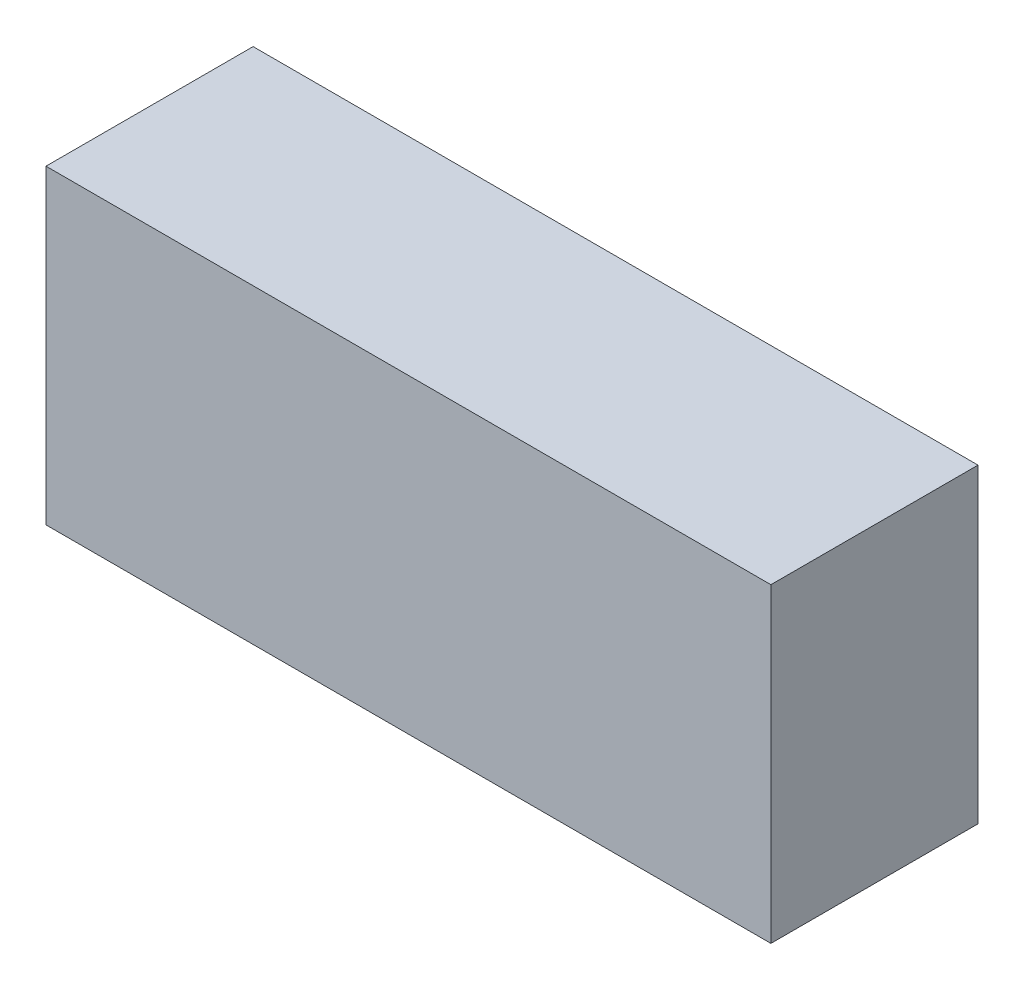
ISO-10303-21;
HEADER;
FILE_DESCRIPTION(('STEP AP214'),'2;1');
FILE_NAME('part.step','',(''),(''),'','','');
FILE_SCHEMA(('AUTOMOTIVE_DESIGN { 1 0 10303 214 1 1 1 1 }'));
ENDSEC;
DATA;
#1=APPLICATION_CONTEXT('core data for automotive mechanical design processes');
#2=APPLICATION_PROTOCOL_DEFINITION('international standard','automotive_design',2000,#1);
#3=PRODUCT_CONTEXT('',#1,'mechanical');
#4=PRODUCT('Part','Part','',(#3));
#5=PRODUCT_RELATED_PRODUCT_CATEGORY('part','',(#4));
#6=PRODUCT_DEFINITION_FORMATION('','',#4);
#7=PRODUCT_DEFINITION_CONTEXT('part definition',#1,'design');
#8=PRODUCT_DEFINITION('design','',#6,#7);
#9=PRODUCT_DEFINITION_SHAPE('','',#8);
#10=(LENGTH_UNIT() NAMED_UNIT(*) SI_UNIT(.MILLI.,.METRE.));
#11=(NAMED_UNIT(*) PLANE_ANGLE_UNIT() SI_UNIT($,.RADIAN.));
#12=(NAMED_UNIT(*) SI_UNIT($,.STERADIAN.) SOLID_ANGLE_UNIT());
#13=UNCERTAINTY_MEASURE_WITH_UNIT(LENGTH_MEASURE(1.E-05),#10,'distance_accuracy_value','');
#14=(GEOMETRIC_REPRESENTATION_CONTEXT(3) GLOBAL_UNCERTAINTY_ASSIGNED_CONTEXT((#13)) GLOBAL_UNIT_ASSIGNED_CONTEXT((#10,
#11,#12)) REPRESENTATION_CONTEXT('',''));
#15=CARTESIAN_POINT('',(0.,0.,0.));
#16=DIRECTION('',(0.,0.,1.));
#17=DIRECTION('',(1.,0.,0.));
#18=AXIS2_PLACEMENT_3D('',#15,#16,#17);
#19=CARTESIAN_POINT('',(0.,0.,20.));
#20=DIRECTION('',(1.,0.,0.));
#21=DIRECTION('',(0.,1.,0.));
#22=AXIS2_PLACEMENT_3D('',#19,#20,#21);
#23=PLANE('',#22);
#24=DIRECTION('',(0.,-1.,0.));
#25=VECTOR('',#24,1.);
#26=CARTESIAN_POINT('',(0.,0.,0.));
#27=LINE('',#26,#25);
#28=CARTESIAN_POINT('',(0.,30.,0.));
#29=VERTEX_POINT('',#28);
#30=CARTESIAN_POINT('',(0.,0.,0.));
#31=VERTEX_POINT('',#30);
#32=EDGE_CURVE('E96',#29,#31,#27,.T.);
#33=ORIENTED_EDGE('',*,*,#32,.T.);
#34=DIRECTION('',(0.,0.,-1.));
#35=VECTOR('',#34,1.);
#36=CARTESIAN_POINT('',(0.,0.,20.));
#37=LINE('',#36,#35);
#38=CARTESIAN_POINT('',(0.,0.,20.));
#39=VERTEX_POINT('',#38);
#40=EDGE_CURVE('E11',#39,#31,#37,.T.);
#41=ORIENTED_EDGE('',*,*,#40,.F.);
#42=DIRECTION('',(0.,-1.,0.));
#43=VECTOR('',#42,1.);
#44=CARTESIAN_POINT('',(0.,0.,20.));
#45=LINE('',#44,#43);
#46=CARTESIAN_POINT('',(0.,30.,20.));
#47=VERTEX_POINT('',#46);
#48=EDGE_CURVE('E84',#47,#39,#45,.T.);
#49=ORIENTED_EDGE('',*,*,#48,.F.);
#50=DIRECTION('',(0.,0.,-1.));
#51=VECTOR('',#50,1.);
#52=CARTESIAN_POINT('',(0.,30.,20.));
#53=LINE('',#52,#51);
#54=EDGE_CURVE('E92',#47,#29,#53,.T.);
#55=ORIENTED_EDGE('',*,*,#54,.T.);
#56=EDGE_LOOP('',(#33,#41,#49,#55));
#57=FACE_BOUND('',#56,.T.);
#58=ADVANCED_FACE('F33',(#57),#23,.F.);
#59=CARTESIAN_POINT('',(0.,0.,20.));
#60=DIRECTION('',(0.,1.,0.));
#61=DIRECTION('',(0.,0.,1.));
#62=AXIS2_PLACEMENT_3D('',#59,#60,#61);
#63=PLANE('',#62);
#64=DIRECTION('',(1.,0.,0.));
#65=VECTOR('',#64,1.);
#66=CARTESIAN_POINT('',(0.,0.,0.));
#67=LINE('',#66,#65);
#68=CARTESIAN_POINT('',(70.,0.,0.));
#69=VERTEX_POINT('',#68);
#70=EDGE_CURVE('E88',#31,#69,#67,.T.);
#71=ORIENTED_EDGE('',*,*,#70,.T.);
#72=DIRECTION('',(0.,0.,-1.));
#73=VECTOR('',#72,1.);
#74=CARTESIAN_POINT('',(70.,0.,20.));
#75=LINE('',#74,#73);
#76=CARTESIAN_POINT('',(70.,0.,20.));
#77=VERTEX_POINT('',#76);
#78=EDGE_CURVE('E41',#77,#69,#75,.T.);
#79=ORIENTED_EDGE('',*,*,#78,.F.);
#80=DIRECTION('',(1.,0.,0.));
#81=VECTOR('',#80,1.);
#82=CARTESIAN_POINT('',(0.,0.,20.));
#83=LINE('',#82,#81);
#84=EDGE_CURVE('E79',#39,#77,#83,.T.);
#85=ORIENTED_EDGE('',*,*,#84,.F.);
#86=ORIENTED_EDGE('',*,*,#40,.T.);
#87=EDGE_LOOP('',(#71,#79,#85,#86));
#88=FACE_BOUND('',#87,.T.);
#89=ADVANCED_FACE('F87',(#88),#63,.F.);
#90=CARTESIAN_POINT('',(70.,0.,20.));
#91=DIRECTION('',(-1.,0.,0.));
#92=DIRECTION('',(0.,-1.,0.));
#93=AXIS2_PLACEMENT_3D('',#90,#91,#92);
#94=PLANE('',#93);
#95=DIRECTION('',(0.,1.,0.));
#96=VECTOR('',#95,1.);
#97=CARTESIAN_POINT('',(70.,0.,0.));
#98=LINE('',#97,#96);
#99=CARTESIAN_POINT('',(70.,30.,0.));
#100=VERTEX_POINT('',#99);
#101=EDGE_CURVE('E66',#69,#100,#98,.T.);
#102=ORIENTED_EDGE('',*,*,#101,.T.);
#103=DIRECTION('',(0.,0.,-1.));
#104=VECTOR('',#103,1.);
#105=CARTESIAN_POINT('',(70.,30.,20.));
#106=LINE('',#105,#104);
#107=CARTESIAN_POINT('',(70.,30.,20.));
#108=VERTEX_POINT('',#107);
#109=EDGE_CURVE('E89',#108,#100,#106,.T.);
#110=ORIENTED_EDGE('',*,*,#109,.F.);
#111=DIRECTION('',(0.,1.,0.));
#112=VECTOR('',#111,1.);
#113=CARTESIAN_POINT('',(70.,0.,20.));
#114=LINE('',#113,#112);
#115=EDGE_CURVE('E82',#77,#108,#114,.T.);
#116=ORIENTED_EDGE('',*,*,#115,.F.);
#117=ORIENTED_EDGE('',*,*,#78,.T.);
#118=EDGE_LOOP('',(#102,#110,#116,#117));
#119=FACE_BOUND('',#118,.T.);
#120=ADVANCED_FACE('F90',(#119),#94,.F.);
#121=CARTESIAN_POINT('',(0.,30.,20.));
#122=DIRECTION('',(0.,-1.,0.));
#123=DIRECTION('',(0.,0.,-1.));
#124=AXIS2_PLACEMENT_3D('',#121,#122,#123);
#125=PLANE('',#124);
#126=DIRECTION('',(-1.,0.,0.));
#127=VECTOR('',#126,1.);
#128=CARTESIAN_POINT('',(0.,30.,0.));
#129=LINE('',#128,#127);
#130=EDGE_CURVE('E72',#100,#29,#129,.T.);
#131=ORIENTED_EDGE('',*,*,#130,.T.);
#132=ORIENTED_EDGE('',*,*,#54,.F.);
#133=DIRECTION('',(-1.,0.,0.));
#134=VECTOR('',#133,1.);
#135=CARTESIAN_POINT('',(0.,30.,20.));
#136=LINE('',#135,#134);
#137=EDGE_CURVE('E49',#108,#47,#136,.T.);
#138=ORIENTED_EDGE('',*,*,#137,.F.);
#139=ORIENTED_EDGE('',*,*,#109,.T.);
#140=EDGE_LOOP('',(#131,#132,#138,#139));
#141=FACE_BOUND('',#140,.T.);
#142=ADVANCED_FACE('F103',(#141),#125,.F.);
#143=CARTESIAN_POINT('',(0.,0.,20.));
#144=DIRECTION('',(0.,0.,-1.));
#145=DIRECTION('',(-1.,0.,0.));
#146=AXIS2_PLACEMENT_3D('',#143,#144,#145);
#147=PLANE('',#146);
#148=ORIENTED_EDGE('',*,*,#48,.T.);
#149=ORIENTED_EDGE('',*,*,#84,.T.);
#150=ORIENTED_EDGE('',*,*,#115,.T.);
#151=ORIENTED_EDGE('',*,*,#137,.T.);
#152=EDGE_LOOP('',(#148,#149,#150,#151));
#153=FACE_BOUND('',#152,.T.);
#154=ADVANCED_FACE('F80',(#153),#147,.F.);
#155=CARTESIAN_POINT('',(0.,0.,0.));
#156=DIRECTION('',(0.,0.,-1.));
#157=DIRECTION('',(-1.,0.,0.));
#158=AXIS2_PLACEMENT_3D('',#155,#156,#157);
#159=PLANE('',#158);
#160=ORIENTED_EDGE('',*,*,#32,.F.);
#161=ORIENTED_EDGE('',*,*,#130,.F.);
#162=ORIENTED_EDGE('',*,*,#101,.F.);
#163=ORIENTED_EDGE('',*,*,#70,.F.);
#164=EDGE_LOOP('',(#160,#161,#162,#163));
#165=FACE_BOUND('',#164,.T.);
#166=ADVANCED_FACE('F106',(#165),#159,.T.);
#167=CLOSED_SHELL('',(#58,#89,#120,#142,#154,#166));
#168=MANIFOLD_SOLID_BREP('B2',#167);
#169=ADVANCED_BREP_SHAPE_REPRESENTATION('',(#18,#168),#14);
#170=SHAPE_DEFINITION_REPRESENTATION(#9,#169);
ENDSEC;
END-ISO-10303-21;
